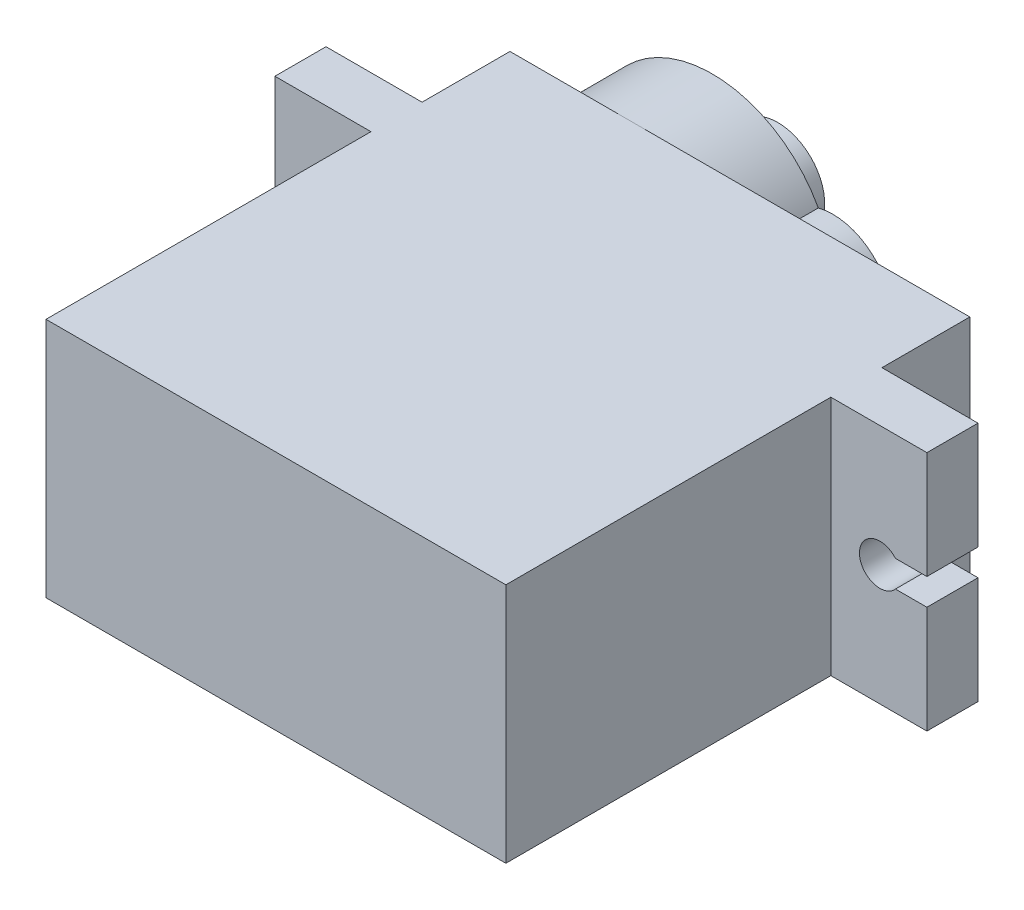
ISO-10303-21;
HEADER;
FILE_DESCRIPTION(('STEP AP214'),'2;1');
FILE_NAME('part.step','',(''),(''),'','','');
FILE_SCHEMA(('AUTOMOTIVE_DESIGN { 1 0 10303 214 1 1 1 1 }'));
ENDSEC;
DATA;
#1=APPLICATION_CONTEXT('core data for automotive mechanical design processes');
#2=APPLICATION_PROTOCOL_DEFINITION('international standard','automotive_design',2000,#1);
#3=PRODUCT_CONTEXT('',#1,'mechanical');
#4=PRODUCT('Part','Part','',(#3));
#5=PRODUCT_RELATED_PRODUCT_CATEGORY('part','',(#4));
#6=PRODUCT_DEFINITION_FORMATION('','',#4);
#7=PRODUCT_DEFINITION_CONTEXT('part definition',#1,'design');
#8=PRODUCT_DEFINITION('design','',#6,#7);
#9=PRODUCT_DEFINITION_SHAPE('','',#8);
#10=(LENGTH_UNIT() NAMED_UNIT(*) SI_UNIT(.MILLI.,.METRE.));
#11=(NAMED_UNIT(*) PLANE_ANGLE_UNIT() SI_UNIT($,.RADIAN.));
#12=(NAMED_UNIT(*) SI_UNIT($,.STERADIAN.) SOLID_ANGLE_UNIT());
#13=UNCERTAINTY_MEASURE_WITH_UNIT(LENGTH_MEASURE(1.E-05),#10,'distance_accuracy_value','');
#14=(GEOMETRIC_REPRESENTATION_CONTEXT(3) GLOBAL_UNCERTAINTY_ASSIGNED_CONTEXT((#13)) GLOBAL_UNIT_ASSIGNED_CONTEXT((#10,
#11,#12)) REPRESENTATION_CONTEXT('',''));
#15=CARTESIAN_POINT('',(0.,0.,0.));
#16=DIRECTION('',(0.,0.,1.));
#17=DIRECTION('',(1.,0.,0.));
#18=AXIS2_PLACEMENT_3D('',#15,#16,#17);
#19=CARTESIAN_POINT('',(-15.95,0.,-6.61789340101523));
#20=DIRECTION('',(-1.,0.,0.));
#21=DIRECTION('',(0.,0.,1.));
#22=AXIS2_PLACEMENT_3D('',#19,#20,#21);
#23=PLANE('',#22);
#24=DIRECTION('',(0.,1.,0.));
#25=VECTOR('',#24,1.);
#26=CARTESIAN_POINT('',(-15.95,0.,-4.11789340101523));
#27=LINE('',#26,#25);
#28=CARTESIAN_POINT('',(-15.95,0.,-4.11789340101523));
#29=VERTEX_POINT('',#28);
#30=CARTESIAN_POINT('',(-15.95,5.25,-4.11789340101523));
#31=VERTEX_POINT('',#30);
#32=EDGE_CURVE('E325',#29,#31,#27,.T.);
#33=ORIENTED_EDGE('',*,*,#32,.T.);
#34=DIRECTION('',(0.,0.,-1.));
#35=VECTOR('',#34,1.);
#36=CARTESIAN_POINT('',(-15.95,5.25,11.7821065989848));
#37=LINE('',#36,#35);
#38=CARTESIAN_POINT('',(-15.95,5.25,-6.61789340101523));
#39=VERTEX_POINT('',#38);
#40=EDGE_CURVE('E246',#31,#39,#37,.T.);
#41=ORIENTED_EDGE('',*,*,#40,.T.);
#42=DIRECTION('',(0.,1.,0.));
#43=VECTOR('',#42,1.);
#44=CARTESIAN_POINT('',(-15.95,0.,-6.61789340101523));
#45=LINE('',#44,#43);
#46=CARTESIAN_POINT('',(-15.95,0.,-6.61789340101523));
#47=VERTEX_POINT('',#46);
#48=EDGE_CURVE('E329',#47,#39,#45,.T.);
#49=ORIENTED_EDGE('',*,*,#48,.F.);
#50=DIRECTION('',(0.,0.,1.));
#51=VECTOR('',#50,1.);
#52=CARTESIAN_POINT('',(-15.95,0.,-6.61789340101523));
#53=LINE('',#52,#51);
#54=EDGE_CURVE('E308',#47,#29,#53,.T.);
#55=ORIENTED_EDGE('',*,*,#54,.T.);
#56=EDGE_LOOP('',(#33,#41,#49,#55));
#57=FACE_BOUND('',#56,.T.);
#58=ADVANCED_FACE('F73',(#57),#23,.T.);
#59=CARTESIAN_POINT('',(11.25,0.,-6.61789340101523));
#60=DIRECTION('',(0.,0.,-1.));
#61=DIRECTION('',(-1.,0.,0.));
#62=AXIS2_PLACEMENT_3D('',#59,#60,#61);
#63=PLANE('',#62);
#64=DIRECTION('',(0.,1.,0.));
#65=VECTOR('',#64,1.);
#66=CARTESIAN_POINT('',(15.95,0.,-6.61789340101523));
#67=LINE('',#66,#65);
#68=CARTESIAN_POINT('',(15.95,6.55,-6.61789340101523));
#69=VERTEX_POINT('',#68);
#70=CARTESIAN_POINT('',(15.95,11.8,-6.61789340101523));
#71=VERTEX_POINT('',#70);
#72=EDGE_CURVE('E357',#69,#71,#67,.T.);
#73=ORIENTED_EDGE('',*,*,#72,.F.);
#74=DIRECTION('',(-1.,0.,0.));
#75=VECTOR('',#74,1.);
#76=CARTESIAN_POINT('',(15.95,6.55,-6.61789340101523));
#77=LINE('',#76,#75);
#78=CARTESIAN_POINT('',(14.4099342076785,6.55,-6.61789340101523));
#79=VERTEX_POINT('',#78);
#80=EDGE_CURVE('E273',#69,#79,#77,.T.);
#81=ORIENTED_EDGE('',*,*,#80,.T.);
#82=CARTESIAN_POINT('',(13.65,5.9,-6.61789340101523));
#83=DIRECTION('',(0.,0.,-1.));
#84=DIRECTION('',(-1.,0.,0.));
#85=AXIS2_PLACEMENT_3D('',#82,#83,#84);
#86=CIRCLE('',#85,1.);
#87=CARTESIAN_POINT('',(14.4099342076785,5.25,-6.61789340101523));
#88=VERTEX_POINT('',#87);
#89=EDGE_CURVE('E269',#88,#79,#86,.T.);
#90=ORIENTED_EDGE('',*,*,#89,.F.);
#91=DIRECTION('',(-1.,0.,0.));
#92=VECTOR('',#91,1.);
#93=CARTESIAN_POINT('',(15.95,5.25,-6.61789340101523));
#94=LINE('',#93,#92);
#95=CARTESIAN_POINT('',(15.95,5.25,-6.61789340101523));
#96=VERTEX_POINT('',#95);
#97=EDGE_CURVE('E270',#96,#88,#94,.T.);
#98=ORIENTED_EDGE('',*,*,#97,.F.);
#99=CARTESIAN_POINT('',(15.95,0.,-6.61789340101523));
#100=VERTEX_POINT('',#99);
#101=EDGE_CURVE('E354',#100,#96,#67,.T.);
#102=ORIENTED_EDGE('',*,*,#101,.F.);
#103=DIRECTION('',(-1.,0.,0.));
#104=VECTOR('',#103,1.);
#105=CARTESIAN_POINT('',(11.25,0.,-6.61789340101523));
#106=LINE('',#105,#104);
#107=CARTESIAN_POINT('',(11.25,0.,-6.61789340101523));
#108=VERTEX_POINT('',#107);
#109=EDGE_CURVE('E341',#100,#108,#106,.T.);
#110=ORIENTED_EDGE('',*,*,#109,.T.);
#111=DIRECTION('',(0.,1.,0.));
#112=VECTOR('',#111,1.);
#113=CARTESIAN_POINT('',(11.25,0.,-6.61789340101523));
#114=LINE('',#113,#112);
#115=CARTESIAN_POINT('',(11.25,11.8,-6.61789340101523));
#116=VERTEX_POINT('',#115);
#117=EDGE_CURVE('E351',#108,#116,#114,.T.);
#118=ORIENTED_EDGE('',*,*,#117,.T.);
#119=DIRECTION('',(-1.,0.,0.));
#120=VECTOR('',#119,1.);
#121=CARTESIAN_POINT('',(11.25,11.8,-6.61789340101523));
#122=LINE('',#121,#120);
#123=EDGE_CURVE('E338',#71,#116,#122,.T.);
#124=ORIENTED_EDGE('',*,*,#123,.F.);
#125=EDGE_LOOP('',(#73,#81,#90,#98,#102,#110,#118,#124));
#126=FACE_BOUND('',#125,.T.);
#127=ADVANCED_FACE('F442',(#126),#63,.T.);
#128=CARTESIAN_POINT('',(15.95,0.,-6.61789340101523));
#129=DIRECTION('',(1.,0.,0.));
#130=DIRECTION('',(0.,0.,-1.));
#131=AXIS2_PLACEMENT_3D('',#128,#129,#130);
#132=PLANE('',#131);
#133=DIRECTION('',(0.,1.,0.));
#134=VECTOR('',#133,1.);
#135=CARTESIAN_POINT('',(15.95,0.,-4.11789340101523));
#136=LINE('',#135,#134);
#137=CARTESIAN_POINT('',(15.95,6.55,-4.11789340101523));
#138=VERTEX_POINT('',#137);
#139=CARTESIAN_POINT('',(15.95,11.8,-4.11789340101523));
#140=VERTEX_POINT('',#139);
#141=EDGE_CURVE('E361',#138,#140,#136,.T.);
#142=ORIENTED_EDGE('',*,*,#141,.F.);
#143=DIRECTION('',(0.,0.,-1.));
#144=VECTOR('',#143,1.);
#145=CARTESIAN_POINT('',(15.95,6.55,11.7821065989848));
#146=LINE('',#145,#144);
#147=EDGE_CURVE('E276',#138,#69,#146,.T.);
#148=ORIENTED_EDGE('',*,*,#147,.T.);
#149=ORIENTED_EDGE('',*,*,#72,.T.);
#150=DIRECTION('',(0.,0.,-1.));
#151=VECTOR('',#150,1.);
#152=CARTESIAN_POINT('',(15.95,11.8,-6.61789340101523));
#153=LINE('',#152,#151);
#154=EDGE_CURVE('E346',#140,#71,#153,.T.);
#155=ORIENTED_EDGE('',*,*,#154,.F.);
#156=EDGE_LOOP('',(#142,#148,#149,#155));
#157=FACE_BOUND('',#156,.T.);
#158=ADVANCED_FACE('F416',(#157),#132,.T.);
#159=CARTESIAN_POINT('',(11.25,0.,-4.11789340101523));
#160=DIRECTION('',(0.,0.,1.));
#161=DIRECTION('',(1.,0.,0.));
#162=AXIS2_PLACEMENT_3D('',#159,#160,#161);
#163=PLANE('',#162);
#164=CARTESIAN_POINT('',(13.65,5.9,-4.11789340101523));
#165=DIRECTION('',(0.,0.,1.));
#166=DIRECTION('',(1.,0.,0.));
#167=AXIS2_PLACEMENT_3D('',#164,#165,#166);
#168=CIRCLE('',#167,1.);
#169=CARTESIAN_POINT('',(14.4099342076785,6.55,-4.11789340101523));
#170=VERTEX_POINT('',#169);
#171=CARTESIAN_POINT('',(14.4099342076785,5.25,-4.11789340101523));
#172=VERTEX_POINT('',#171);
#173=EDGE_CURVE('E403',#170,#172,#168,.T.);
#174=ORIENTED_EDGE('',*,*,#173,.F.);
#175=DIRECTION('',(1.,0.,0.));
#176=VECTOR('',#175,1.);
#177=CARTESIAN_POINT('',(11.25,6.55,-4.11789340101523));
#178=LINE('',#177,#176);
#179=EDGE_CURVE('E81',#170,#138,#178,.T.);
#180=ORIENTED_EDGE('',*,*,#179,.T.);
#181=ORIENTED_EDGE('',*,*,#141,.T.);
#182=DIRECTION('',(1.,0.,0.));
#183=VECTOR('',#182,1.);
#184=CARTESIAN_POINT('',(11.25,11.8,-4.11789340101523));
#185=LINE('',#184,#183);
#186=CARTESIAN_POINT('',(11.25,11.8,-4.11789340101523));
#187=VERTEX_POINT('',#186);
#188=EDGE_CURVE('E324',#187,#140,#185,.T.);
#189=ORIENTED_EDGE('',*,*,#188,.F.);
#190=DIRECTION('',(0.,1.,0.));
#191=VECTOR('',#190,1.);
#192=CARTESIAN_POINT('',(11.25,0.,-4.11789340101523));
#193=LINE('',#192,#191);
#194=CARTESIAN_POINT('',(11.25,0.,-4.11789340101523));
#195=VERTEX_POINT('',#194);
#196=EDGE_CURVE('E343',#195,#187,#193,.T.);
#197=ORIENTED_EDGE('',*,*,#196,.F.);
#198=DIRECTION('',(1.,0.,0.));
#199=VECTOR('',#198,1.);
#200=CARTESIAN_POINT('',(11.25,0.,-4.11789340101523));
#201=LINE('',#200,#199);
#202=CARTESIAN_POINT('',(15.95,0.,-4.11789340101523));
#203=VERTEX_POINT('',#202);
#204=EDGE_CURVE('E334',#195,#203,#201,.T.);
#205=ORIENTED_EDGE('',*,*,#204,.T.);
#206=CARTESIAN_POINT('',(15.95,5.25,-4.11789340101523));
#207=VERTEX_POINT('',#206);
#208=EDGE_CURVE('E358',#203,#207,#136,.T.);
#209=ORIENTED_EDGE('',*,*,#208,.T.);
#210=DIRECTION('',(1.,0.,0.));
#211=VECTOR('',#210,1.);
#212=CARTESIAN_POINT('',(11.25,5.25,-4.11789340101523));
#213=LINE('',#212,#211);
#214=EDGE_CURVE('E405',#172,#207,#213,.T.);
#215=ORIENTED_EDGE('',*,*,#214,.F.);
#216=EDGE_LOOP('',(#174,#180,#181,#189,#197,#205,#209,#215));
#217=FACE_BOUND('',#216,.T.);
#218=ADVANCED_FACE('F411',(#217),#163,.T.);
#219=CARTESIAN_POINT('',(-11.25,11.8,-10.9178934010152));
#220=DIRECTION('',(0.,0.,1.));
#221=DIRECTION('',(1.,0.,0.));
#222=AXIS2_PLACEMENT_3D('',#219,#220,#221);
#223=PLANE('',#222);
#224=CARTESIAN_POINT('',(-5.35,5.9,-10.9178934010152));
#225=DIRECTION('',(0.,0.,-1.));
#226=DIRECTION('',(-1.,0.,0.));
#227=AXIS2_PLACEMENT_3D('',#224,#225,#226);
#228=CIRCLE('',#227,5.9);
#229=CARTESIAN_POINT('',(-11.25,5.9,-10.9178934010152));
#230=VERTEX_POINT('',#229);
#231=CARTESIAN_POINT('',(-5.35,11.8,-10.9178934010152));
#232=VERTEX_POINT('',#231);
#233=EDGE_CURVE('E296',#230,#232,#228,.T.);
#234=ORIENTED_EDGE('',*,*,#233,.F.);
#235=DIRECTION('',(0.,-1.,0.));
#236=VECTOR('',#235,1.);
#237=CARTESIAN_POINT('',(-11.25,11.8,-10.9178934010152));
#238=LINE('',#237,#236);
#239=CARTESIAN_POINT('',(-11.25,11.8,-10.9178934010152));
#240=VERTEX_POINT('',#239);
#241=EDGE_CURVE('E392',#240,#230,#238,.T.);
#242=ORIENTED_EDGE('',*,*,#241,.F.);
#243=DIRECTION('',(-1.,0.,0.));
#244=VECTOR('',#243,1.);
#245=CARTESIAN_POINT('',(-11.25,11.8,-10.9178934010152));
#246=LINE('',#245,#244);
#247=EDGE_CURVE('E374',#232,#240,#246,.T.);
#248=ORIENTED_EDGE('',*,*,#247,.F.);
#249=EDGE_LOOP('',(#234,#242,#248));
#250=FACE_BOUND('',#249,.T.);
#251=ADVANCED_FACE('F501',(#250),#223,.F.);
#252=CARTESIAN_POINT('',(-0.162711864406775,3.08894293933157,-10.9178934010152));
#253=VERTEX_POINT('',#252);
#254=CARTESIAN_POINT('',(-5.35,0.,-10.9178934010152));
#255=VERTEX_POINT('',#254);
#256=EDGE_CURVE('E303',#253,#255,#228,.T.);
#257=ORIENTED_EDGE('',*,*,#256,.F.);
#258=CARTESIAN_POINT('',(0.550000000000005,5.9,-10.9178934010152));
#259=DIRECTION('',(0.,0.,-1.));
#260=DIRECTION('',(-1.,0.,0.));
#261=AXIS2_PLACEMENT_3D('',#258,#259,#260);
#262=CIRCLE('',#261,2.9);
#263=CARTESIAN_POINT('',(-0.162711864406775,8.71105706066843,-10.9178934010152));
#264=VERTEX_POINT('',#263);
#265=EDGE_CURVE('E287',#264,#253,#262,.T.);
#266=ORIENTED_EDGE('',*,*,#265,.F.);
#267=EDGE_CURVE('E406',#232,#264,#228,.T.);
#268=ORIENTED_EDGE('',*,*,#267,.F.);
#269=CARTESIAN_POINT('',(11.25,11.8,-10.9178934010152));
#270=VERTEX_POINT('',#269);
#271=EDGE_CURVE('E375',#270,#232,#246,.T.);
#272=ORIENTED_EDGE('',*,*,#271,.F.);
#273=DIRECTION('',(0.,-1.,0.));
#274=VECTOR('',#273,1.);
#275=CARTESIAN_POINT('',(11.25,11.8,-10.9178934010152));
#276=LINE('',#275,#274);
#277=CARTESIAN_POINT('',(11.25,0.,-10.9178934010152));
#278=VERTEX_POINT('',#277);
#279=EDGE_CURVE('E394',#270,#278,#276,.T.);
#280=ORIENTED_EDGE('',*,*,#279,.T.);
#281=DIRECTION('',(-1.,0.,0.));
#282=VECTOR('',#281,1.);
#283=CARTESIAN_POINT('',(-11.25,0.,-10.9178934010152));
#284=LINE('',#283,#282);
#285=EDGE_CURVE('E389',#278,#255,#284,.T.);
#286=ORIENTED_EDGE('',*,*,#285,.T.);
#287=EDGE_LOOP('',(#257,#266,#268,#272,#280,#286));
#288=FACE_BOUND('',#287,.T.);
#289=ADVANCED_FACE('F502',(#288),#223,.F.);
#290=CARTESIAN_POINT('',(-11.25,11.8,11.7821065989848));
#291=DIRECTION('',(1.,0.,0.));
#292=DIRECTION('',(0.,0.,-1.));
#293=AXIS2_PLACEMENT_3D('',#290,#291,#292);
#294=PLANE('',#293);
#295=DIRECTION('',(0.,1.,0.));
#296=VECTOR('',#295,1.);
#297=CARTESIAN_POINT('',(-11.25,0.,-4.11789340101523));
#298=LINE('',#297,#296);
#299=CARTESIAN_POINT('',(-11.25,0.,-4.11789340101523));
#300=VERTEX_POINT('',#299);
#301=CARTESIAN_POINT('',(-11.25,11.8,-4.11789340101523));
#302=VERTEX_POINT('',#301);
#303=EDGE_CURVE('E322',#300,#302,#298,.T.);
#304=ORIENTED_EDGE('',*,*,#303,.F.);
#305=DIRECTION('',(0.,0.,1.));
#306=VECTOR('',#305,1.);
#307=CARTESIAN_POINT('',(-11.25,0.,11.7821065989848));
#308=LINE('',#307,#306);
#309=CARTESIAN_POINT('',(-11.25,0.,11.7821065989848));
#310=VERTEX_POINT('',#309);
#311=EDGE_CURVE('E353',#300,#310,#308,.T.);
#312=ORIENTED_EDGE('',*,*,#311,.T.);
#313=DIRECTION('',(0.,-1.,0.));
#314=VECTOR('',#313,1.);
#315=CARTESIAN_POINT('',(-11.25,11.8,11.7821065989848));
#316=LINE('',#315,#314);
#317=CARTESIAN_POINT('',(-11.25,11.8,11.7821065989848));
#318=VERTEX_POINT('',#317);
#319=EDGE_CURVE('E400',#318,#310,#316,.T.);
#320=ORIENTED_EDGE('',*,*,#319,.F.);
#321=DIRECTION('',(0.,0.,1.));
#322=VECTOR('',#321,1.);
#323=CARTESIAN_POINT('',(-11.25,11.8,11.7821065989848));
#324=LINE('',#323,#322);
#325=EDGE_CURVE('E368',#302,#318,#324,.T.);
#326=ORIENTED_EDGE('',*,*,#325,.F.);
#327=EDGE_LOOP('',(#304,#312,#320,#326));
#328=FACE_BOUND('',#327,.T.);
#329=ADVANCED_FACE('F485',(#328),#294,.F.);
#330=CARTESIAN_POINT('',(11.25,11.8,11.7821065989848));
#331=DIRECTION('',(-1.,0.,0.));
#332=DIRECTION('',(0.,0.,1.));
#333=AXIS2_PLACEMENT_3D('',#330,#331,#332);
#334=PLANE('',#333);
#335=ORIENTED_EDGE('',*,*,#117,.F.);
#336=DIRECTION('',(0.,0.,-1.));
#337=VECTOR('',#336,1.);
#338=CARTESIAN_POINT('',(11.25,0.,11.7821065989848));
#339=LINE('',#338,#337);
#340=EDGE_CURVE('E384',#108,#278,#339,.T.);
#341=ORIENTED_EDGE('',*,*,#340,.T.);
#342=ORIENTED_EDGE('',*,*,#279,.F.);
#343=DIRECTION('',(0.,0.,-1.));
#344=VECTOR('',#343,1.);
#345=CARTESIAN_POINT('',(11.25,11.8,11.7821065989848));
#346=LINE('',#345,#344);
#347=EDGE_CURVE('E370',#116,#270,#346,.T.);
#348=ORIENTED_EDGE('',*,*,#347,.F.);
#349=EDGE_LOOP('',(#335,#341,#342,#348));
#350=FACE_BOUND('',#349,.T.);
#351=ADVANCED_FACE('F495',(#350),#334,.F.);
#352=CARTESIAN_POINT('',(-11.25,0.,-10.9178934010152));
#353=VERTEX_POINT('',#352);
#354=CARTESIAN_POINT('',(-11.25,0.,-6.61789340101523));
#355=VERTEX_POINT('',#354);
#356=EDGE_CURVE('E379',#353,#355,#308,.T.);
#357=ORIENTED_EDGE('',*,*,#356,.T.);
#358=DIRECTION('',(0.,1.,0.));
#359=VECTOR('',#358,1.);
#360=CARTESIAN_POINT('',(-11.25,0.,-6.61789340101523));
#361=LINE('',#360,#359);
#362=CARTESIAN_POINT('',(-11.25,11.8,-6.61789340101523));
#363=VERTEX_POINT('',#362);
#364=EDGE_CURVE('E314',#355,#363,#361,.T.);
#365=ORIENTED_EDGE('',*,*,#364,.T.);
#366=EDGE_CURVE('E364',#240,#363,#324,.T.);
#367=ORIENTED_EDGE('',*,*,#366,.F.);
#368=ORIENTED_EDGE('',*,*,#241,.T.);
#369=EDGE_CURVE('E378',#230,#353,#238,.T.);
#370=ORIENTED_EDGE('',*,*,#369,.T.);
#371=EDGE_LOOP('',(#357,#365,#367,#368,#370));
#372=FACE_BOUND('',#371,.T.);
#373=ADVANCED_FACE('F75',(#372),#294,.F.);
#374=CARTESIAN_POINT('',(-11.25,11.8,11.7821065989848));
#375=DIRECTION('',(0.,0.,-1.));
#376=DIRECTION('',(-1.,0.,0.));
#377=AXIS2_PLACEMENT_3D('',#374,#375,#376);
#378=PLANE('',#377);
#379=DIRECTION('',(1.,0.,0.));
#380=VECTOR('',#379,1.);
#381=CARTESIAN_POINT('',(-11.25,0.,11.7821065989848));
#382=LINE('',#381,#380);
#383=CARTESIAN_POINT('',(11.25,0.,11.7821065989848));
#384=VERTEX_POINT('',#383);
#385=EDGE_CURVE('E382',#310,#384,#382,.T.);
#386=ORIENTED_EDGE('',*,*,#385,.T.);
#387=DIRECTION('',(0.,-1.,0.));
#388=VECTOR('',#387,1.);
#389=CARTESIAN_POINT('',(11.25,11.8,11.7821065989848));
#390=LINE('',#389,#388);
#391=CARTESIAN_POINT('',(11.25,11.8,11.7821065989848));
#392=VERTEX_POINT('',#391);
#393=EDGE_CURVE('E397',#392,#384,#390,.T.);
#394=ORIENTED_EDGE('',*,*,#393,.F.);
#395=DIRECTION('',(1.,0.,0.));
#396=VECTOR('',#395,1.);
#397=CARTESIAN_POINT('',(-11.25,11.8,11.7821065989848));
#398=LINE('',#397,#396);
#399=EDGE_CURVE('E367',#318,#392,#398,.T.);
#400=ORIENTED_EDGE('',*,*,#399,.F.);
#401=ORIENTED_EDGE('',*,*,#319,.T.);
#402=EDGE_LOOP('',(#386,#394,#400,#401));
#403=FACE_BOUND('',#402,.T.);
#404=ADVANCED_FACE('F487',(#403),#378,.F.);
#405=EDGE_CURVE('E385',#384,#195,#339,.T.);
#406=ORIENTED_EDGE('',*,*,#405,.T.);
#407=ORIENTED_EDGE('',*,*,#196,.T.);
#408=EDGE_CURVE('E371',#392,#187,#346,.T.);
#409=ORIENTED_EDGE('',*,*,#408,.F.);
#410=ORIENTED_EDGE('',*,*,#393,.T.);
#411=EDGE_LOOP('',(#406,#407,#409,#410));
#412=FACE_BOUND('',#411,.T.);
#413=ADVANCED_FACE('F424',(#412),#334,.F.);
#414=EDGE_CURVE('E304',#255,#230,#228,.T.);
#415=ORIENTED_EDGE('',*,*,#414,.F.);
#416=EDGE_CURVE('E388',#255,#353,#284,.T.);
#417=ORIENTED_EDGE('',*,*,#416,.T.);
#418=ORIENTED_EDGE('',*,*,#369,.F.);
#419=EDGE_LOOP('',(#415,#417,#418));
#420=FACE_BOUND('',#419,.T.);
#421=ADVANCED_FACE('F493',(#420),#223,.F.);
#422=CARTESIAN_POINT('',(0.,11.8,0.));
#423=DIRECTION('',(0.,-1.,0.));
#424=DIRECTION('',(0.,0.,-1.));
#425=AXIS2_PLACEMENT_3D('',#422,#423,#424);
#426=PLANE('',#425);
#427=ORIENTED_EDGE('',*,*,#366,.T.);
#428=DIRECTION('',(-1.,0.,0.));
#429=VECTOR('',#428,1.);
#430=CARTESIAN_POINT('',(-11.25,11.8,-6.61789340101523));
#431=LINE('',#430,#429);
#432=CARTESIAN_POINT('',(-15.95,11.8,-6.61789340101523));
#433=VERTEX_POINT('',#432);
#434=EDGE_CURVE('E300',#363,#433,#431,.T.);
#435=ORIENTED_EDGE('',*,*,#434,.T.);
#436=DIRECTION('',(0.,0.,1.));
#437=VECTOR('',#436,1.);
#438=CARTESIAN_POINT('',(-15.95,11.8,-6.61789340101523));
#439=LINE('',#438,#437);
#440=CARTESIAN_POINT('',(-15.95,11.8,-4.11789340101523));
#441=VERTEX_POINT('',#440);
#442=EDGE_CURVE('E317',#433,#441,#439,.T.);
#443=ORIENTED_EDGE('',*,*,#442,.T.);
#444=DIRECTION('',(1.,0.,0.));
#445=VECTOR('',#444,1.);
#446=CARTESIAN_POINT('',(-11.25,11.8,-4.11789340101523));
#447=LINE('',#446,#445);
#448=EDGE_CURVE('E309',#441,#302,#447,.T.);
#449=ORIENTED_EDGE('',*,*,#448,.T.);
#450=ORIENTED_EDGE('',*,*,#325,.T.);
#451=ORIENTED_EDGE('',*,*,#399,.T.);
#452=ORIENTED_EDGE('',*,*,#408,.T.);
#453=ORIENTED_EDGE('',*,*,#188,.T.);
#454=ORIENTED_EDGE('',*,*,#154,.T.);
#455=ORIENTED_EDGE('',*,*,#123,.T.);
#456=ORIENTED_EDGE('',*,*,#347,.T.);
#457=ORIENTED_EDGE('',*,*,#271,.T.);
#458=ORIENTED_EDGE('',*,*,#247,.T.);
#459=EDGE_LOOP('',(#427,#435,#443,#449,#450,#451,#452,#453,#454,#455,#456,#457,#458));
#460=FACE_BOUND('',#459,.T.);
#461=ADVANCED_FACE('F420',(#460),#426,.F.);
#462=CARTESIAN_POINT('',(0.,0.,0.));
#463=DIRECTION('',(0.,-1.,0.));
#464=DIRECTION('',(0.,0.,-1.));
#465=AXIS2_PLACEMENT_3D('',#462,#463,#464);
#466=PLANE('',#465);
#467=ORIENTED_EDGE('',*,*,#356,.F.);
#468=ORIENTED_EDGE('',*,*,#416,.F.);
#469=ORIENTED_EDGE('',*,*,#285,.F.);
#470=ORIENTED_EDGE('',*,*,#340,.F.);
#471=ORIENTED_EDGE('',*,*,#109,.F.);
#472=DIRECTION('',(0.,0.,-1.));
#473=VECTOR('',#472,1.);
#474=CARTESIAN_POINT('',(15.95,0.,-6.61789340101523));
#475=LINE('',#474,#473);
#476=EDGE_CURVE('E337',#203,#100,#475,.T.);
#477=ORIENTED_EDGE('',*,*,#476,.F.);
#478=ORIENTED_EDGE('',*,*,#204,.F.);
#479=ORIENTED_EDGE('',*,*,#405,.F.);
#480=ORIENTED_EDGE('',*,*,#385,.F.);
#481=ORIENTED_EDGE('',*,*,#311,.F.);
#482=DIRECTION('',(1.,0.,0.));
#483=VECTOR('',#482,1.);
#484=CARTESIAN_POINT('',(-11.25,0.,-4.11789340101523));
#485=LINE('',#484,#483);
#486=EDGE_CURVE('E312',#29,#300,#485,.T.);
#487=ORIENTED_EDGE('',*,*,#486,.F.);
#488=ORIENTED_EDGE('',*,*,#54,.F.);
#489=DIRECTION('',(-1.,0.,0.));
#490=VECTOR('',#489,1.);
#491=CARTESIAN_POINT('',(-11.25,0.,-6.61789340101523));
#492=LINE('',#491,#490);
#493=EDGE_CURVE('E305',#355,#47,#492,.T.);
#494=ORIENTED_EDGE('',*,*,#493,.F.);
#495=EDGE_LOOP('',(#467,#468,#469,#470,#471,#477,#478,#479,#480,#481,#487,#488,#494));
#496=FACE_BOUND('',#495,.T.);
#497=ADVANCED_FACE('F430',(#496),#466,.T.);
#498=DIRECTION('',(0.,0.,-1.));
#499=VECTOR('',#498,1.);
#500=CARTESIAN_POINT('',(15.95,5.25,11.7821065989848));
#501=LINE('',#500,#499);
#502=EDGE_CURVE('E277',#207,#96,#501,.T.);
#503=ORIENTED_EDGE('',*,*,#502,.F.);
#504=ORIENTED_EDGE('',*,*,#208,.F.);
#505=ORIENTED_EDGE('',*,*,#476,.T.);
#506=ORIENTED_EDGE('',*,*,#101,.T.);
#507=EDGE_LOOP('',(#503,#504,#505,#506));
#508=FACE_BOUND('',#507,.T.);
#509=ADVANCED_FACE('F436',(#508),#132,.T.);
#510=CARTESIAN_POINT('',(-11.25,0.,-4.11789340101523));
#511=DIRECTION('',(0.,0.,1.));
#512=DIRECTION('',(1.,0.,0.));
#513=AXIS2_PLACEMENT_3D('',#510,#511,#512);
#514=PLANE('',#513);
#515=DIRECTION('',(-1.,0.,0.));
#516=VECTOR('',#515,1.);
#517=CARTESIAN_POINT('',(-11.25,6.55,-4.11789340101523));
#518=LINE('',#517,#516);
#519=CARTESIAN_POINT('',(-14.4099342076785,6.55,-4.11789340101523));
#520=VERTEX_POINT('',#519);
#521=CARTESIAN_POINT('',(-15.95,6.55,-4.11789340101523));
#522=VERTEX_POINT('',#521);
#523=EDGE_CURVE('E266',#520,#522,#518,.T.);
#524=ORIENTED_EDGE('',*,*,#523,.F.);
#525=CARTESIAN_POINT('',(-13.65,5.9,-4.11789340101523));
#526=DIRECTION('',(0.,0.,1.));
#527=DIRECTION('',(1.,0.,0.));
#528=AXIS2_PLACEMENT_3D('',#525,#526,#527);
#529=CIRCLE('',#528,1.);
#530=CARTESIAN_POINT('',(-14.4099342076785,5.25,-4.11789340101523));
#531=VERTEX_POINT('',#530);
#532=EDGE_CURVE('E234',#531,#520,#529,.T.);
#533=ORIENTED_EDGE('',*,*,#532,.F.);
#534=DIRECTION('',(-1.,0.,0.));
#535=VECTOR('',#534,1.);
#536=CARTESIAN_POINT('',(-11.25,5.25,-4.11789340101523));
#537=LINE('',#536,#535);
#538=EDGE_CURVE('E258',#531,#31,#537,.T.);
#539=ORIENTED_EDGE('',*,*,#538,.T.);
#540=ORIENTED_EDGE('',*,*,#32,.F.);
#541=ORIENTED_EDGE('',*,*,#486,.T.);
#542=ORIENTED_EDGE('',*,*,#303,.T.);
#543=ORIENTED_EDGE('',*,*,#448,.F.);
#544=EDGE_CURVE('E328',#522,#441,#27,.T.);
#545=ORIENTED_EDGE('',*,*,#544,.F.);
#546=EDGE_LOOP('',(#524,#533,#539,#540,#541,#542,#543,#545));
#547=FACE_BOUND('',#546,.T.);
#548=ADVANCED_FACE('F469',(#547),#514,.T.);
#549=DIRECTION('',(0.,0.,-1.));
#550=VECTOR('',#549,1.);
#551=CARTESIAN_POINT('',(-15.95,6.55,11.7821065989848));
#552=LINE('',#551,#550);
#553=CARTESIAN_POINT('',(-15.95,6.55,-6.61789340101523));
#554=VERTEX_POINT('',#553);
#555=EDGE_CURVE('E243',#522,#554,#552,.T.);
#556=ORIENTED_EDGE('',*,*,#555,.F.);
#557=ORIENTED_EDGE('',*,*,#544,.T.);
#558=ORIENTED_EDGE('',*,*,#442,.F.);
#559=EDGE_CURVE('E331',#554,#433,#45,.T.);
#560=ORIENTED_EDGE('',*,*,#559,.F.);
#561=EDGE_LOOP('',(#556,#557,#558,#560));
#562=FACE_BOUND('',#561,.T.);
#563=ADVANCED_FACE('F461',(#562),#23,.T.);
#564=CARTESIAN_POINT('',(-11.25,0.,-6.61789340101523));
#565=DIRECTION('',(0.,0.,-1.));
#566=DIRECTION('',(-1.,0.,0.));
#567=AXIS2_PLACEMENT_3D('',#564,#565,#566);
#568=PLANE('',#567);
#569=DIRECTION('',(1.,0.,0.));
#570=VECTOR('',#569,1.);
#571=CARTESIAN_POINT('',(-15.95,6.55,-6.61789340101523));
#572=LINE('',#571,#570);
#573=CARTESIAN_POINT('',(-14.4099342076785,6.55,-6.61789340101523));
#574=VERTEX_POINT('',#573);
#575=EDGE_CURVE('E240',#554,#574,#572,.T.);
#576=ORIENTED_EDGE('',*,*,#575,.F.);
#577=ORIENTED_EDGE('',*,*,#559,.T.);
#578=ORIENTED_EDGE('',*,*,#434,.F.);
#579=ORIENTED_EDGE('',*,*,#364,.F.);
#580=ORIENTED_EDGE('',*,*,#493,.T.);
#581=ORIENTED_EDGE('',*,*,#48,.T.);
#582=DIRECTION('',(1.,0.,0.));
#583=VECTOR('',#582,1.);
#584=CARTESIAN_POINT('',(-15.95,5.25,-6.61789340101523));
#585=LINE('',#584,#583);
#586=CARTESIAN_POINT('',(-14.4099342076785,5.25,-6.61789340101523));
#587=VERTEX_POINT('',#586);
#588=EDGE_CURVE('E247',#39,#587,#585,.T.);
#589=ORIENTED_EDGE('',*,*,#588,.T.);
#590=CARTESIAN_POINT('',(-13.65,5.9,-6.61789340101523));
#591=DIRECTION('',(0.,0.,-1.));
#592=DIRECTION('',(-1.,0.,0.));
#593=AXIS2_PLACEMENT_3D('',#590,#591,#592);
#594=CIRCLE('',#593,1.);
#595=EDGE_CURVE('E88',#574,#587,#594,.T.);
#596=ORIENTED_EDGE('',*,*,#595,.F.);
#597=EDGE_LOOP('',(#576,#577,#578,#579,#580,#581,#589,#596));
#598=FACE_BOUND('',#597,.T.);
#599=ADVANCED_FACE('F250',(#598),#568,.T.);
#600=CARTESIAN_POINT('',(-5.35,5.9,-14.9178934010152));
#601=DIRECTION('',(0.,0.,1.));
#602=DIRECTION('',(1.,0.,0.));
#603=AXIS2_PLACEMENT_3D('',#600,#601,#602);
#604=CYLINDRICAL_SURFACE('',#603,5.9);
#605=ORIENTED_EDGE('',*,*,#267,.T.);
#606=DIRECTION('',(0.,0.,-1.));
#607=VECTOR('',#606,1.);
#608=CARTESIAN_POINT('',(-0.162711864406774,8.71105706066843,-12.9178934010152));
#609=LINE('',#608,#607);
#610=CARTESIAN_POINT('',(-0.162711864406774,8.71105706066843,-14.9178934010152));
#611=VERTEX_POINT('',#610);
#612=EDGE_CURVE('E293',#264,#611,#609,.T.);
#613=ORIENTED_EDGE('',*,*,#612,.T.);
#614=CARTESIAN_POINT('',(-5.35,5.9,-14.9178934010152));
#615=DIRECTION('',(0.,0.,-1.));
#616=DIRECTION('',(-1.,0.,0.));
#617=AXIS2_PLACEMENT_3D('',#614,#615,#616);
#618=CIRCLE('',#617,5.9);
#619=CARTESIAN_POINT('',(-0.162711864406774,3.08894293933157,-14.9178934010152));
#620=VERTEX_POINT('',#619);
#621=EDGE_CURVE('E297',#620,#611,#618,.T.);
#622=ORIENTED_EDGE('',*,*,#621,.F.);
#623=DIRECTION('',(0.,0.,-1.));
#624=VECTOR('',#623,1.);
#625=CARTESIAN_POINT('',(-0.162711864406774,3.08894293933157,-12.9178934010152));
#626=LINE('',#625,#624);
#627=EDGE_CURVE('E289',#620,#253,#626,.F.);
#628=ORIENTED_EDGE('',*,*,#627,.T.);
#629=ORIENTED_EDGE('',*,*,#256,.T.);
#630=ORIENTED_EDGE('',*,*,#414,.T.);
#631=ORIENTED_EDGE('',*,*,#233,.T.);
#632=EDGE_LOOP('',(#605,#613,#622,#628,#629,#630,#631));
#633=FACE_BOUND('',#632,.T.);
#634=ADVANCED_FACE('F475',(#633),#604,.T.);
#635=CARTESIAN_POINT('',(-5.35,5.9,-14.9178934010152));
#636=DIRECTION('',(0.,0.,-1.));
#637=DIRECTION('',(-1.,0.,0.));
#638=AXIS2_PLACEMENT_3D('',#635,#636,#637);
#639=PLANE('',#638);
#640=CARTESIAN_POINT('',(-5.35,5.84285595372492,-14.9178934010152));
#641=DIRECTION('',(0.,0.,-1.));
#642=DIRECTION('',(-1.,0.,0.));
#643=AXIS2_PLACEMENT_3D('',#640,#641,#642);
#644=CIRCLE('',#643,2.3);
#645=CARTESIAN_POINT('',(-7.65,5.84285595372492,-14.9178934010152));
#646=VERTEX_POINT('',#645);
#647=EDGE_CURVE('E256',#646,#646,#644,.T.);
#648=ORIENTED_EDGE('',*,*,#647,.F.);
#649=EDGE_LOOP('',(#648));
#650=FACE_BOUND('',#649,.T.);
#651=ORIENTED_EDGE('',*,*,#621,.T.);
#652=CARTESIAN_POINT('',(0.550000000000005,5.9,-14.9178934010152));
#653=DIRECTION('',(0.,0.,-1.));
#654=DIRECTION('',(-1.,0.,0.));
#655=AXIS2_PLACEMENT_3D('',#652,#653,#654);
#656=CIRCLE('',#655,2.9);
#657=EDGE_CURVE('E286',#611,#620,#656,.T.);
#658=ORIENTED_EDGE('',*,*,#657,.T.);
#659=EDGE_LOOP('',(#651,#658));
#660=FACE_BOUND('',#659,.T.);
#661=ADVANCED_FACE('F590',(#650,#660),#639,.T.);
#662=CARTESIAN_POINT('',(0.550000000000005,5.9,-10.9178934010152));
#663=DIRECTION('',(0.,0.,-1.));
#664=DIRECTION('',(-1.,0.,0.));
#665=AXIS2_PLACEMENT_3D('',#662,#663,#664);
#666=CYLINDRICAL_SURFACE('',#665,2.9);
#667=ORIENTED_EDGE('',*,*,#612,.F.);
#668=ORIENTED_EDGE('',*,*,#265,.T.);
#669=ORIENTED_EDGE('',*,*,#627,.F.);
#670=ORIENTED_EDGE('',*,*,#657,.F.);
#671=EDGE_LOOP('',(#667,#668,#669,#670));
#672=FACE_BOUND('',#671,.T.);
#673=ADVANCED_FACE('F598',(#672),#666,.T.);
#674=CARTESIAN_POINT('',(15.95,6.55,11.7821065989848));
#675=DIRECTION('',(0.,-1.,0.));
#676=DIRECTION('',(0.,0.,-1.));
#677=AXIS2_PLACEMENT_3D('',#674,#675,#676);
#678=PLANE('',#677);
#679=DIRECTION('',(0.,0.,-1.));
#680=VECTOR('',#679,1.);
#681=CARTESIAN_POINT('',(14.4099342076785,6.55,11.7821065989848));
#682=LINE('',#681,#680);
#683=EDGE_CURVE('E96',#79,#170,#682,.F.);
#684=ORIENTED_EDGE('',*,*,#683,.F.);
#685=ORIENTED_EDGE('',*,*,#80,.F.);
#686=ORIENTED_EDGE('',*,*,#147,.F.);
#687=ORIENTED_EDGE('',*,*,#179,.F.);
#688=EDGE_LOOP('',(#684,#685,#686,#687));
#689=FACE_BOUND('',#688,.T.);
#690=ADVANCED_FACE('F453',(#689),#678,.T.);
#691=CARTESIAN_POINT('',(15.95,5.25,11.7821065989848));
#692=DIRECTION('',(0.,-1.,0.));
#693=DIRECTION('',(0.,0.,-1.));
#694=AXIS2_PLACEMENT_3D('',#691,#692,#693);
#695=PLANE('',#694);
#696=ORIENTED_EDGE('',*,*,#214,.T.);
#697=ORIENTED_EDGE('',*,*,#502,.T.);
#698=ORIENTED_EDGE('',*,*,#97,.T.);
#699=DIRECTION('',(0.,0.,-1.));
#700=VECTOR('',#699,1.);
#701=CARTESIAN_POINT('',(14.4099342076785,5.25,11.7821065989848));
#702=LINE('',#701,#700);
#703=EDGE_CURVE('E283',#88,#172,#702,.F.);
#704=ORIENTED_EDGE('',*,*,#703,.T.);
#705=EDGE_LOOP('',(#696,#697,#698,#704));
#706=FACE_BOUND('',#705,.T.);
#707=ADVANCED_FACE('F439',(#706),#695,.F.);
#708=CARTESIAN_POINT('',(13.65,5.9,11.7821065989848));
#709=DIRECTION('',(0.,0.,-1.));
#710=DIRECTION('',(-1.,0.,0.));
#711=AXIS2_PLACEMENT_3D('',#708,#709,#710);
#712=CYLINDRICAL_SURFACE('',#711,1.);
#713=ORIENTED_EDGE('',*,*,#173,.T.);
#714=ORIENTED_EDGE('',*,*,#703,.F.);
#715=ORIENTED_EDGE('',*,*,#89,.T.);
#716=ORIENTED_EDGE('',*,*,#683,.T.);
#717=EDGE_LOOP('',(#713,#714,#715,#716));
#718=FACE_BOUND('',#717,.T.);
#719=ADVANCED_FACE('F443',(#718),#712,.F.);
#720=CARTESIAN_POINT('',(-13.65,5.9,11.7821065989848));
#721=DIRECTION('',(0.,0.,-1.));
#722=DIRECTION('',(-1.,0.,0.));
#723=AXIS2_PLACEMENT_3D('',#720,#721,#722);
#724=CYLINDRICAL_SURFACE('',#723,1.);
#725=ORIENTED_EDGE('',*,*,#532,.T.);
#726=DIRECTION('',(0.,0.,-1.));
#727=VECTOR('',#726,1.);
#728=CARTESIAN_POINT('',(-14.4099342076785,6.55,11.7821065989848));
#729=LINE('',#728,#727);
#730=EDGE_CURVE('E230',#520,#574,#729,.T.);
#731=ORIENTED_EDGE('',*,*,#730,.T.);
#732=ORIENTED_EDGE('',*,*,#595,.T.);
#733=DIRECTION('',(0.,0.,-1.));
#734=VECTOR('',#733,1.);
#735=CARTESIAN_POINT('',(-14.4099342076785,5.25,11.7821065989848));
#736=LINE('',#735,#734);
#737=EDGE_CURVE('E237',#531,#587,#736,.T.);
#738=ORIENTED_EDGE('',*,*,#737,.F.);
#739=EDGE_LOOP('',(#725,#731,#732,#738));
#740=FACE_BOUND('',#739,.T.);
#741=ADVANCED_FACE('F232',(#740),#724,.F.);
#742=CARTESIAN_POINT('',(-15.95,6.55,11.7821065989848));
#743=DIRECTION('',(0.,1.,0.));
#744=DIRECTION('',(0.,0.,1.));
#745=AXIS2_PLACEMENT_3D('',#742,#743,#744);
#746=PLANE('',#745);
#747=ORIENTED_EDGE('',*,*,#523,.T.);
#748=ORIENTED_EDGE('',*,*,#555,.T.);
#749=ORIENTED_EDGE('',*,*,#575,.T.);
#750=ORIENTED_EDGE('',*,*,#730,.F.);
#751=EDGE_LOOP('',(#747,#748,#749,#750));
#752=FACE_BOUND('',#751,.T.);
#753=ADVANCED_FACE('F241',(#752),#746,.F.);
#754=CARTESIAN_POINT('',(-15.95,5.25,11.7821065989848));
#755=DIRECTION('',(0.,1.,0.));
#756=DIRECTION('',(0.,0.,1.));
#757=AXIS2_PLACEMENT_3D('',#754,#755,#756);
#758=PLANE('',#757);
#759=ORIENTED_EDGE('',*,*,#737,.T.);
#760=ORIENTED_EDGE('',*,*,#588,.F.);
#761=ORIENTED_EDGE('',*,*,#40,.F.);
#762=ORIENTED_EDGE('',*,*,#538,.F.);
#763=EDGE_LOOP('',(#759,#760,#761,#762));
#764=FACE_BOUND('',#763,.T.);
#765=ADVANCED_FACE('F452',(#764),#758,.T.);
#766=CARTESIAN_POINT('',(-5.35,5.84285595372492,-18.1178934010152));
#767=DIRECTION('',(0.,0.,-1.));
#768=DIRECTION('',(-1.,0.,0.));
#769=AXIS2_PLACEMENT_3D('',#766,#767,#768);
#770=PLANE('',#769);
#771=CARTESIAN_POINT('',(-5.35,5.84285595372492,-18.1178934010152));
#772=DIRECTION('',(0.,0.,-1.));
#773=DIRECTION('',(-1.,0.,0.));
#774=AXIS2_PLACEMENT_3D('',#771,#772,#773);
#775=CIRCLE('',#774,2.3);
#776=CARTESIAN_POINT('',(-7.65,5.84285595372492,-18.1178934010152));
#777=VERTEX_POINT('',#776);
#778=EDGE_CURVE('E260',#777,#777,#775,.T.);
#779=ORIENTED_EDGE('',*,*,#778,.T.);
#780=EDGE_LOOP('',(#779));
#781=FACE_BOUND('',#780,.T.);
#782=CARTESIAN_POINT('',(-5.35,5.84285595372492,-18.1178934010152));
#783=DIRECTION('',(0.,0.,-1.));
#784=DIRECTION('',(-1.,0.,0.));
#785=AXIS2_PLACEMENT_3D('',#782,#783,#784);
#786=CIRCLE('',#785,0.85);
#787=CARTESIAN_POINT('',(-6.2,5.84285595372492,-18.1178934010152));
#788=VERTEX_POINT('',#787);
#789=EDGE_CURVE('E814',#788,#788,#786,.T.);
#790=ORIENTED_EDGE('',*,*,#789,.F.);
#791=EDGE_LOOP('',(#790));
#792=FACE_BOUND('',#791,.T.);
#793=ADVANCED_FACE('F451',(#781,#792),#770,.T.);
#794=CARTESIAN_POINT('',(-5.35,5.84285595372492,-18.1178934010152));
#795=DIRECTION('',(0.,0.,1.));
#796=DIRECTION('',(1.,0.,0.));
#797=AXIS2_PLACEMENT_3D('',#794,#795,#796);
#798=CYLINDRICAL_SURFACE('',#797,2.3);
#799=ORIENTED_EDGE('',*,*,#778,.F.);
#800=EDGE_LOOP('',(#799));
#801=FACE_BOUND('',#800,.T.);
#802=ORIENTED_EDGE('',*,*,#647,.T.);
#803=EDGE_LOOP('',(#802));
#804=FACE_BOUND('',#803,.T.);
#805=ADVANCED_FACE('F659',(#801,#804),#798,.T.);
#806=CARTESIAN_POINT('',(-5.35,5.84285595372492,-18.1178934010152));
#807=DIRECTION('',(0.,0.,1.));
#808=DIRECTION('',(1.,0.,0.));
#809=AXIS2_PLACEMENT_3D('',#806,#807,#808);
#810=CYLINDRICAL_SURFACE('',#809,0.85);
#811=ORIENTED_EDGE('',*,*,#789,.T.);
#812=EDGE_LOOP('',(#811));
#813=FACE_BOUND('',#812,.T.);
#814=CARTESIAN_POINT('',(-5.35,5.84285595372492,-14.9178934010152));
#815=DIRECTION('',(0.,0.,-1.));
#816=DIRECTION('',(-1.,0.,0.));
#817=AXIS2_PLACEMENT_3D('',#814,#815,#816);
#818=CIRCLE('',#817,0.85);
#819=CARTESIAN_POINT('',(-6.2,5.84285595372492,-14.9178934010152));
#820=VERTEX_POINT('',#819);
#821=EDGE_CURVE('E12',#820,#820,#818,.F.);
#822=ORIENTED_EDGE('',*,*,#821,.T.);
#823=EDGE_LOOP('',(#822));
#824=FACE_BOUND('',#823,.T.);
#825=ADVANCED_FACE('F649',(#813,#824),#810,.F.);
#826=ORIENTED_EDGE('',*,*,#821,.F.);
#827=EDGE_LOOP('',(#826));
#828=FACE_BOUND('',#827,.T.);
#829=ADVANCED_FACE('F644',(#828),#639,.T.);
#830=CLOSED_SHELL('',(#58,#127,#158,#218,#251,#289,#329,#351,#373,#404,#413,#421,#461,#497,#509,
#548,#563,#599,#634,#661,#673,#690,#707,#719,#741,#753,#765,#793,#805,#825,#829));
#831=MANIFOLD_SOLID_BREP('B2',#830);
#832=ADVANCED_BREP_SHAPE_REPRESENTATION('',(#18,#831),#14);
#833=SHAPE_DEFINITION_REPRESENTATION(#9,#832);
ENDSEC;
END-ISO-10303-21;
